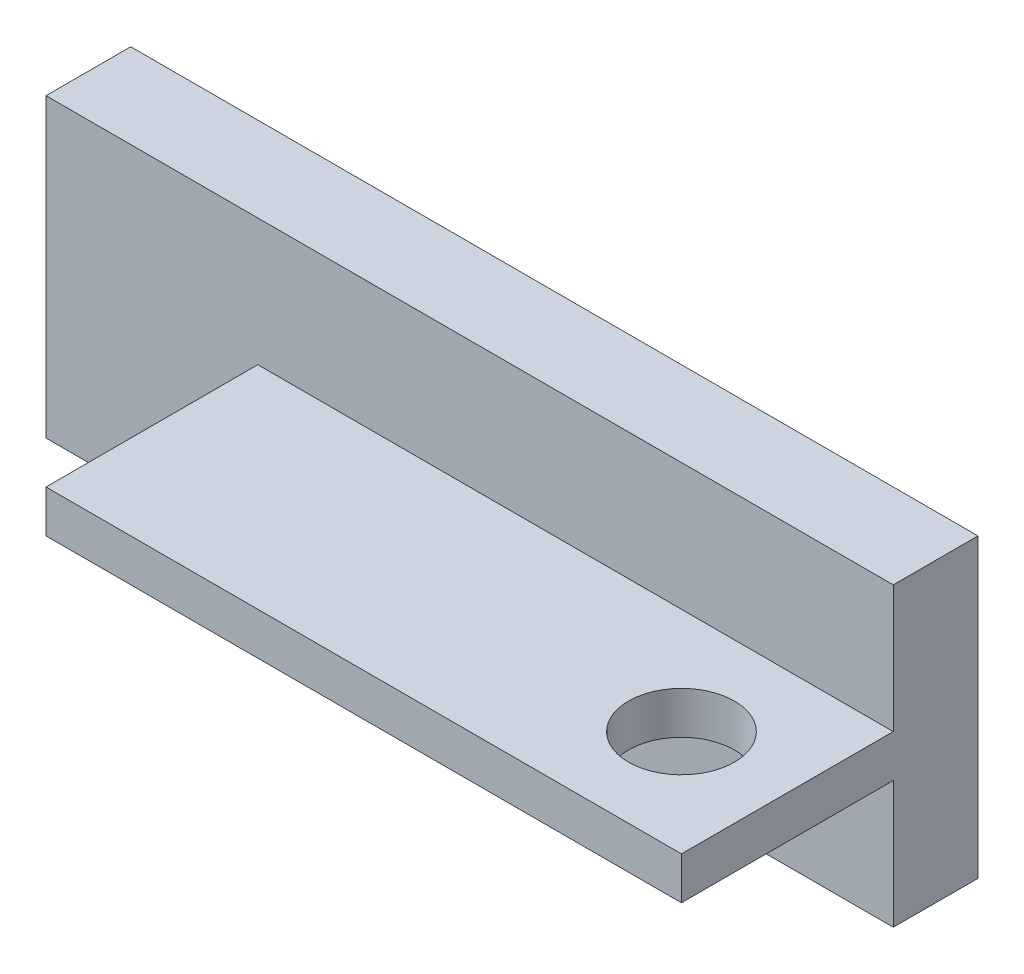
ISO-10303-21;
HEADER;
FILE_DESCRIPTION(('STEP AP214'),'2;1');
FILE_NAME('part.step','',(''),(''),'','','');
FILE_SCHEMA(('AUTOMOTIVE_DESIGN { 1 0 10303 214 1 1 1 1 }'));
ENDSEC;
DATA;
#1=APPLICATION_CONTEXT('core data for automotive mechanical design processes');
#2=APPLICATION_PROTOCOL_DEFINITION('international standard','automotive_design',2000,#1);
#3=PRODUCT_CONTEXT('',#1,'mechanical');
#4=PRODUCT('Part','Part','',(#3));
#5=PRODUCT_RELATED_PRODUCT_CATEGORY('part','',(#4));
#6=PRODUCT_DEFINITION_FORMATION('','',#4);
#7=PRODUCT_DEFINITION_CONTEXT('part definition',#1,'design');
#8=PRODUCT_DEFINITION('design','',#6,#7);
#9=PRODUCT_DEFINITION_SHAPE('','',#8);
#10=(LENGTH_UNIT() NAMED_UNIT(*) SI_UNIT(.MILLI.,.METRE.));
#11=(NAMED_UNIT(*) PLANE_ANGLE_UNIT() SI_UNIT($,.RADIAN.));
#12=(NAMED_UNIT(*) SI_UNIT($,.STERADIAN.) SOLID_ANGLE_UNIT());
#13=UNCERTAINTY_MEASURE_WITH_UNIT(LENGTH_MEASURE(1.E-05),#10,'distance_accuracy_value','');
#14=(GEOMETRIC_REPRESENTATION_CONTEXT(3) GLOBAL_UNCERTAINTY_ASSIGNED_CONTEXT((#13)) GLOBAL_UNIT_ASSIGNED_CONTEXT((#10,
#11,#12)) REPRESENTATION_CONTEXT('',''));
#15=CARTESIAN_POINT('',(0.,0.,0.));
#16=DIRECTION('',(0.,0.,1.));
#17=DIRECTION('',(1.,0.,0.));
#18=AXIS2_PLACEMENT_3D('',#15,#16,#17);
#19=CARTESIAN_POINT('',(0.,0.,0.));
#20=DIRECTION('',(0.,1.,0.));
#21=DIRECTION('',(0.,0.,1.));
#22=AXIS2_PLACEMENT_3D('',#19,#20,#21);
#23=PLANE('',#22);
#24=CARTESIAN_POINT('',(-25.,0.,-25.));
#25=DIRECTION('',(0.,1.,0.));
#26=DIRECTION('',(0.,0.,1.));
#27=AXIS2_PLACEMENT_3D('',#24,#25,#26);
#28=CIRCLE('',#27,12.5);
#29=CARTESIAN_POINT('',(-25.,0.,-12.5));
#30=VERTEX_POINT('',#29);
#31=EDGE_CURVE('E140',#30,#30,#28,.T.);
#32=ORIENTED_EDGE('',*,*,#31,.T.);
#33=EDGE_LOOP('',(#32));
#34=FACE_BOUND('',#33,.T.);
#35=DIRECTION('',(1.,0.,0.));
#36=VECTOR('',#35,1.);
#37=CARTESIAN_POINT('',(0.,0.,0.));
#38=LINE('',#37,#36);
#39=CARTESIAN_POINT('',(-150.,0.,0.));
#40=VERTEX_POINT('',#39);
#41=CARTESIAN_POINT('',(0.,0.,0.));
#42=VERTEX_POINT('',#41);
#43=EDGE_CURVE('E123',#40,#42,#38,.T.);
#44=ORIENTED_EDGE('',*,*,#43,.F.);
#45=DIRECTION('',(0.,0.,-1.));
#46=VECTOR('',#45,1.);
#47=CARTESIAN_POINT('',(-150.,0.,0.));
#48=LINE('',#47,#46);
#49=CARTESIAN_POINT('',(-150.,0.,-50.));
#50=VERTEX_POINT('',#49);
#51=EDGE_CURVE('E102',#40,#50,#48,.T.);
#52=ORIENTED_EDGE('',*,*,#51,.T.);
#53=DIRECTION('',(-1.,0.,0.));
#54=VECTOR('',#53,1.);
#55=CARTESIAN_POINT('',(0.,0.,-50.));
#56=LINE('',#55,#54);
#57=CARTESIAN_POINT('',(0.,0.,-50.));
#58=VERTEX_POINT('',#57);
#59=EDGE_CURVE('E59',#58,#50,#56,.T.);
#60=ORIENTED_EDGE('',*,*,#59,.F.);
#61=DIRECTION('',(0.,0.,-1.));
#62=VECTOR('',#61,1.);
#63=CARTESIAN_POINT('',(0.,0.,0.));
#64=LINE('',#63,#62);
#65=EDGE_CURVE('E131',#42,#58,#64,.T.);
#66=ORIENTED_EDGE('',*,*,#65,.F.);
#67=EDGE_LOOP('',(#44,#52,#60,#66));
#68=FACE_BOUND('',#67,.T.);
#69=ADVANCED_FACE('F33',(#34,#68),#23,.F.);
#70=CARTESIAN_POINT('',(0.,10.,0.));
#71=DIRECTION('',(-1.,0.,0.));
#72=DIRECTION('',(0.,0.,1.));
#73=AXIS2_PLACEMENT_3D('',#70,#71,#72);
#74=PLANE('',#73);
#75=ORIENTED_EDGE('',*,*,#65,.T.);
#76=DIRECTION('',(0.,1.,0.));
#77=VECTOR('',#76,1.);
#78=CARTESIAN_POINT('',(0.,-30.,-50.));
#79=LINE('',#78,#77);
#80=CARTESIAN_POINT('',(0.,-30.,-50.));
#81=VERTEX_POINT('',#80);
#82=EDGE_CURVE('E141',#81,#58,#79,.T.);
#83=ORIENTED_EDGE('',*,*,#82,.F.);
#84=DIRECTION('',(0.,0.,1.));
#85=VECTOR('',#84,1.);
#86=CARTESIAN_POINT('',(0.,-30.,-70.));
#87=LINE('',#86,#85);
#88=CARTESIAN_POINT('',(0.,-30.,-70.));
#89=VERTEX_POINT('',#88);
#90=EDGE_CURVE('E139',#89,#81,#87,.T.);
#91=ORIENTED_EDGE('',*,*,#90,.F.);
#92=DIRECTION('',(0.,-1.,0.));
#93=VECTOR('',#92,1.);
#94=CARTESIAN_POINT('',(0.,10.,-70.));
#95=LINE('',#94,#93);
#96=CARTESIAN_POINT('',(0.,40.,-70.));
#97=VERTEX_POINT('',#96);
#98=EDGE_CURVE('E11',#97,#89,#95,.T.);
#99=ORIENTED_EDGE('',*,*,#98,.F.);
#100=DIRECTION('',(0.,0.,-1.));
#101=VECTOR('',#100,1.);
#102=CARTESIAN_POINT('',(0.,40.,-70.));
#103=LINE('',#102,#101);
#104=CARTESIAN_POINT('',(0.,40.,-50.));
#105=VERTEX_POINT('',#104);
#106=EDGE_CURVE('E147',#105,#97,#103,.T.);
#107=ORIENTED_EDGE('',*,*,#106,.F.);
#108=DIRECTION('',(0.,-1.,0.));
#109=VECTOR('',#108,1.);
#110=CARTESIAN_POINT('',(0.,40.,-50.));
#111=LINE('',#110,#109);
#112=CARTESIAN_POINT('',(0.,10.,-50.));
#113=VERTEX_POINT('',#112);
#114=EDGE_CURVE('E156',#105,#113,#111,.T.);
#115=ORIENTED_EDGE('',*,*,#114,.T.);
#116=DIRECTION('',(0.,0.,-1.));
#117=VECTOR('',#116,1.);
#118=CARTESIAN_POINT('',(0.,10.,0.));
#119=LINE('',#118,#117);
#120=CARTESIAN_POINT('',(0.,10.,0.));
#121=VERTEX_POINT('',#120);
#122=EDGE_CURVE('E120',#121,#113,#119,.T.);
#123=ORIENTED_EDGE('',*,*,#122,.F.);
#124=DIRECTION('',(0.,-1.,0.));
#125=VECTOR('',#124,1.);
#126=CARTESIAN_POINT('',(0.,10.,0.));
#127=LINE('',#126,#125);
#128=EDGE_CURVE('E118',#121,#42,#127,.T.);
#129=ORIENTED_EDGE('',*,*,#128,.T.);
#130=EDGE_LOOP('',(#75,#83,#91,#99,#107,#115,#123,#129));
#131=FACE_BOUND('',#130,.T.);
#132=ADVANCED_FACE('F35',(#131),#74,.F.);
#133=CARTESIAN_POINT('',(0.,10.,-70.));
#134=DIRECTION('',(0.,0.,1.));
#135=DIRECTION('',(1.,0.,0.));
#136=AXIS2_PLACEMENT_3D('',#133,#134,#135);
#137=PLANE('',#136);
#138=ORIENTED_EDGE('',*,*,#98,.T.);
#139=DIRECTION('',(1.,0.,0.));
#140=VECTOR('',#139,1.);
#141=CARTESIAN_POINT('',(0.,-30.,-70.));
#142=LINE('',#141,#140);
#143=CARTESIAN_POINT('',(-200.,-30.,-70.));
#144=VERTEX_POINT('',#143);
#145=EDGE_CURVE('E145',#144,#89,#142,.T.);
#146=ORIENTED_EDGE('',*,*,#145,.F.);
#147=DIRECTION('',(0.,-1.,0.));
#148=VECTOR('',#147,1.);
#149=CARTESIAN_POINT('',(-200.,10.,-70.));
#150=LINE('',#149,#148);
#151=CARTESIAN_POINT('',(-200.,40.,-70.));
#152=VERTEX_POINT('',#151);
#153=EDGE_CURVE('E43',#152,#144,#150,.T.);
#154=ORIENTED_EDGE('',*,*,#153,.F.);
#155=DIRECTION('',(-1.,0.,0.));
#156=VECTOR('',#155,1.);
#157=CARTESIAN_POINT('',(0.,40.,-70.));
#158=LINE('',#157,#156);
#159=EDGE_CURVE('E150',#97,#152,#158,.T.);
#160=ORIENTED_EDGE('',*,*,#159,.F.);
#161=EDGE_LOOP('',(#138,#146,#154,#160));
#162=FACE_BOUND('',#161,.T.);
#163=ADVANCED_FACE('F185',(#162),#137,.F.);
#164=CARTESIAN_POINT('',(-200.,10.,0.));
#165=DIRECTION('',(1.,0.,0.));
#166=DIRECTION('',(0.,0.,-1.));
#167=AXIS2_PLACEMENT_3D('',#164,#165,#166);
#168=PLANE('',#167);
#169=DIRECTION('',(0.,0.,-1.));
#170=VECTOR('',#169,1.);
#171=CARTESIAN_POINT('',(-200.,-30.,-70.));
#172=LINE('',#171,#170);
#173=CARTESIAN_POINT('',(-200.,-30.,-50.));
#174=VERTEX_POINT('',#173);
#175=EDGE_CURVE('E174',#174,#144,#172,.T.);
#176=ORIENTED_EDGE('',*,*,#175,.F.);
#177=DIRECTION('',(0.,-1.,0.));
#178=VECTOR('',#177,1.);
#179=CARTESIAN_POINT('',(-200.,40.,-50.));
#180=LINE('',#179,#178);
#181=CARTESIAN_POINT('',(-200.,40.,-50.));
#182=VERTEX_POINT('',#181);
#183=EDGE_CURVE('E134',#182,#174,#180,.T.);
#184=ORIENTED_EDGE('',*,*,#183,.F.);
#185=DIRECTION('',(0.,0.,1.));
#186=VECTOR('',#185,1.);
#187=CARTESIAN_POINT('',(-200.,40.,-70.));
#188=LINE('',#187,#186);
#189=EDGE_CURVE('E153',#152,#182,#188,.T.);
#190=ORIENTED_EDGE('',*,*,#189,.F.);
#191=ORIENTED_EDGE('',*,*,#153,.T.);
#192=EDGE_LOOP('',(#176,#184,#190,#191));
#193=FACE_BOUND('',#192,.T.);
#194=ADVANCED_FACE('F172',(#193),#168,.F.);
#195=CARTESIAN_POINT('',(0.,10.,0.));
#196=DIRECTION('',(0.,0.,-1.));
#197=DIRECTION('',(-1.,0.,0.));
#198=AXIS2_PLACEMENT_3D('',#195,#196,#197);
#199=PLANE('',#198);
#200=DIRECTION('',(1.,0.,0.));
#201=VECTOR('',#200,1.);
#202=CARTESIAN_POINT('',(0.,10.,0.));
#203=LINE('',#202,#201);
#204=CARTESIAN_POINT('',(-150.,10.,0.));
#205=VERTEX_POINT('',#204);
#206=EDGE_CURVE('E113',#205,#121,#203,.T.);
#207=ORIENTED_EDGE('',*,*,#206,.F.);
#208=DIRECTION('',(0.,1.,0.));
#209=VECTOR('',#208,1.);
#210=CARTESIAN_POINT('',(-150.,-20.,0.));
#211=LINE('',#210,#209);
#212=EDGE_CURVE('E100',#40,#205,#211,.T.);
#213=ORIENTED_EDGE('',*,*,#212,.F.);
#214=ORIENTED_EDGE('',*,*,#43,.T.);
#215=ORIENTED_EDGE('',*,*,#128,.F.);
#216=EDGE_LOOP('',(#207,#213,#214,#215));
#217=FACE_BOUND('',#216,.T.);
#218=ADVANCED_FACE('F116',(#217),#199,.F.);
#219=CARTESIAN_POINT('',(0.,10.,0.));
#220=DIRECTION('',(0.,1.,0.));
#221=DIRECTION('',(0.,0.,1.));
#222=AXIS2_PLACEMENT_3D('',#219,#220,#221);
#223=PLANE('',#222);
#224=DIRECTION('',(0.,0.,-1.));
#225=VECTOR('',#224,1.);
#226=CARTESIAN_POINT('',(-150.,10.,0.));
#227=LINE('',#226,#225);
#228=CARTESIAN_POINT('',(-150.,10.,-50.));
#229=VERTEX_POINT('',#228);
#230=EDGE_CURVE('E51',#205,#229,#227,.T.);
#231=ORIENTED_EDGE('',*,*,#230,.F.);
#232=ORIENTED_EDGE('',*,*,#206,.T.);
#233=ORIENTED_EDGE('',*,*,#122,.T.);
#234=DIRECTION('',(1.,0.,0.));
#235=VECTOR('',#234,1.);
#236=CARTESIAN_POINT('',(0.,10.,-50.));
#237=LINE('',#236,#235);
#238=EDGE_CURVE('E37',#229,#113,#237,.T.);
#239=ORIENTED_EDGE('',*,*,#238,.F.);
#240=EDGE_LOOP('',(#231,#232,#233,#239));
#241=FACE_BOUND('',#240,.T.);
#242=CARTESIAN_POINT('',(-25.,10.,-25.));
#243=DIRECTION('',(0.,1.,0.));
#244=DIRECTION('',(0.,0.,1.));
#245=AXIS2_PLACEMENT_3D('',#242,#243,#244);
#246=CIRCLE('',#245,12.5);
#247=CARTESIAN_POINT('',(-25.,10.,-12.5));
#248=VERTEX_POINT('',#247);
#249=EDGE_CURVE('E190',#248,#248,#246,.T.);
#250=ORIENTED_EDGE('',*,*,#249,.F.);
#251=EDGE_LOOP('',(#250));
#252=FACE_BOUND('',#251,.T.);
#253=ADVANCED_FACE('F110',(#241,#252),#223,.T.);
#254=CARTESIAN_POINT('',(0.,40.,-50.));
#255=DIRECTION('',(0.,0.,-1.));
#256=DIRECTION('',(-1.,0.,0.));
#257=AXIS2_PLACEMENT_3D('',#254,#255,#256);
#258=PLANE('',#257);
#259=ORIENTED_EDGE('',*,*,#183,.T.);
#260=DIRECTION('',(-1.,0.,0.));
#261=VECTOR('',#260,1.);
#262=CARTESIAN_POINT('',(0.,-30.,-50.));
#263=LINE('',#262,#261);
#264=EDGE_CURVE('E184',#81,#174,#263,.T.);
#265=ORIENTED_EDGE('',*,*,#264,.F.);
#266=ORIENTED_EDGE('',*,*,#82,.T.);
#267=ORIENTED_EDGE('',*,*,#59,.T.);
#268=DIRECTION('',(0.,1.,0.));
#269=VECTOR('',#268,1.);
#270=CARTESIAN_POINT('',(-150.,-20.,-50.));
#271=LINE('',#270,#269);
#272=EDGE_CURVE('E106',#50,#229,#271,.T.);
#273=ORIENTED_EDGE('',*,*,#272,.T.);
#274=ORIENTED_EDGE('',*,*,#238,.T.);
#275=ORIENTED_EDGE('',*,*,#114,.F.);
#276=DIRECTION('',(1.,0.,0.));
#277=VECTOR('',#276,1.);
#278=CARTESIAN_POINT('',(0.,40.,-50.));
#279=LINE('',#278,#277);
#280=EDGE_CURVE('E155',#182,#105,#279,.T.);
#281=ORIENTED_EDGE('',*,*,#280,.F.);
#282=EDGE_LOOP('',(#259,#265,#266,#267,#273,#274,#275,#281));
#283=FACE_BOUND('',#282,.T.);
#284=ADVANCED_FACE('F189',(#283),#258,.F.);
#285=CARTESIAN_POINT('',(0.,40.,0.));
#286=DIRECTION('',(0.,-1.,0.));
#287=DIRECTION('',(0.,0.,-1.));
#288=AXIS2_PLACEMENT_3D('',#285,#286,#287);
#289=PLANE('',#288);
#290=ORIENTED_EDGE('',*,*,#106,.T.);
#291=ORIENTED_EDGE('',*,*,#159,.T.);
#292=ORIENTED_EDGE('',*,*,#189,.T.);
#293=ORIENTED_EDGE('',*,*,#280,.T.);
#294=EDGE_LOOP('',(#290,#291,#292,#293));
#295=FACE_BOUND('',#294,.T.);
#296=ADVANCED_FACE('F199',(#295),#289,.F.);
#297=CARTESIAN_POINT('',(0.,-30.,0.));
#298=DIRECTION('',(0.,-1.,0.));
#299=DIRECTION('',(0.,0.,-1.));
#300=AXIS2_PLACEMENT_3D('',#297,#298,#299);
#301=PLANE('',#300);
#302=ORIENTED_EDGE('',*,*,#90,.T.);
#303=ORIENTED_EDGE('',*,*,#264,.T.);
#304=ORIENTED_EDGE('',*,*,#175,.T.);
#305=ORIENTED_EDGE('',*,*,#145,.T.);
#306=EDGE_LOOP('',(#302,#303,#304,#305));
#307=FACE_BOUND('',#306,.T.);
#308=ADVANCED_FACE('F182',(#307),#301,.T.);
#309=CARTESIAN_POINT('',(-25.,-20.,-25.));
#310=DIRECTION('',(0.,1.,0.));
#311=DIRECTION('',(0.,0.,1.));
#312=AXIS2_PLACEMENT_3D('',#309,#310,#311);
#313=CYLINDRICAL_SURFACE('',#312,12.5);
#314=ORIENTED_EDGE('',*,*,#249,.T.);
#315=EDGE_LOOP('',(#314));
#316=FACE_BOUND('',#315,.T.);
#317=ORIENTED_EDGE('',*,*,#31,.F.);
#318=EDGE_LOOP('',(#317));
#319=FACE_BOUND('',#318,.T.);
#320=ADVANCED_FACE('F206',(#316,#319),#313,.F.);
#321=CARTESIAN_POINT('',(-150.,-20.,0.));
#322=DIRECTION('',(1.,0.,0.));
#323=DIRECTION('',(0.,0.,-1.));
#324=AXIS2_PLACEMENT_3D('',#321,#322,#323);
#325=PLANE('',#324);
#326=ORIENTED_EDGE('',*,*,#212,.T.);
#327=ORIENTED_EDGE('',*,*,#230,.T.);
#328=ORIENTED_EDGE('',*,*,#272,.F.);
#329=ORIENTED_EDGE('',*,*,#51,.F.);
#330=EDGE_LOOP('',(#326,#327,#328,#329));
#331=FACE_BOUND('',#330,.T.);
#332=ADVANCED_FACE('F101',(#331),#325,.F.);
#333=CLOSED_SHELL('',(#69,#132,#163,#194,#218,#253,#284,#296,#308,#320,#332));
#334=MANIFOLD_SOLID_BREP('B2',#333);
#335=ADVANCED_BREP_SHAPE_REPRESENTATION('',(#18,#334),#14);
#336=SHAPE_DEFINITION_REPRESENTATION(#9,#335);
ENDSEC;
END-ISO-10303-21;
